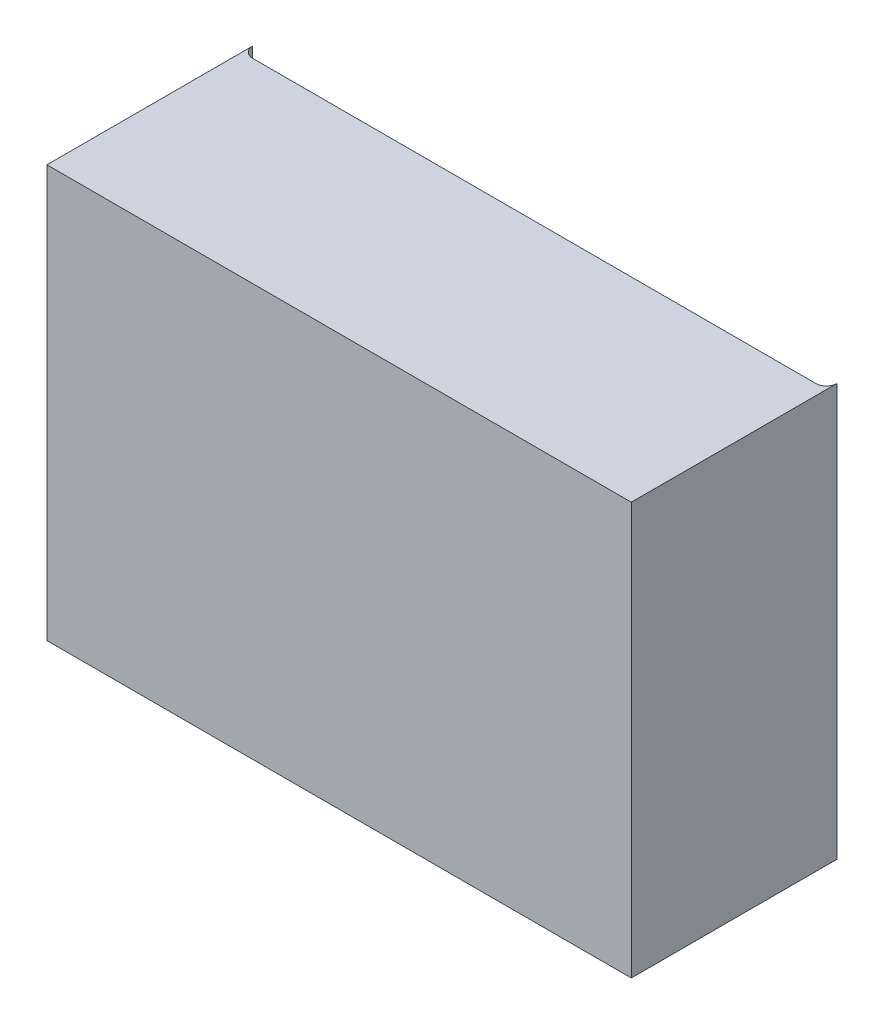
ISO-10303-21;
HEADER;
FILE_DESCRIPTION(('STEP AP214'),'2;1');
FILE_NAME('part.step','',(''),(''),'','','');
FILE_SCHEMA(('AUTOMOTIVE_DESIGN { 1 0 10303 214 1 1 1 1 }'));
ENDSEC;
DATA;
#1=APPLICATION_CONTEXT('core data for automotive mechanical design processes');
#2=APPLICATION_PROTOCOL_DEFINITION('international standard','automotive_design',2000,#1);
#3=PRODUCT_CONTEXT('',#1,'mechanical');
#4=PRODUCT('Part','Part','',(#3));
#5=PRODUCT_RELATED_PRODUCT_CATEGORY('part','',(#4));
#6=PRODUCT_DEFINITION_FORMATION('','',#4);
#7=PRODUCT_DEFINITION_CONTEXT('part definition',#1,'design');
#8=PRODUCT_DEFINITION('design','',#6,#7);
#9=PRODUCT_DEFINITION_SHAPE('','',#8);
#10=(LENGTH_UNIT() NAMED_UNIT(*) SI_UNIT(.MILLI.,.METRE.));
#11=(NAMED_UNIT(*) PLANE_ANGLE_UNIT() SI_UNIT($,.RADIAN.));
#12=(NAMED_UNIT(*) SI_UNIT($,.STERADIAN.) SOLID_ANGLE_UNIT());
#13=UNCERTAINTY_MEASURE_WITH_UNIT(LENGTH_MEASURE(1.E-05),#10,'distance_accuracy_value','');
#14=(GEOMETRIC_REPRESENTATION_CONTEXT(3) GLOBAL_UNCERTAINTY_ASSIGNED_CONTEXT((#13)) GLOBAL_UNIT_ASSIGNED_CONTEXT((#10,
#11,#12)) REPRESENTATION_CONTEXT('',''));
#15=CARTESIAN_POINT('',(0.,0.,0.));
#16=DIRECTION('',(0.,0.,1.));
#17=DIRECTION('',(1.,0.,0.));
#18=AXIS2_PLACEMENT_3D('',#15,#16,#17);
#19=CARTESIAN_POINT('',(1.052,0.77,0.12));
#20=DIRECTION('',(0.,-1.,0.));
#21=DIRECTION('',(0.,0.,-1.));
#22=AXIS2_PLACEMENT_3D('',#19,#20,#21);
#23=CYLINDRICAL_SURFACE('',#22,0.04);
#24=DIRECTION('',(0.,1.,0.));
#25=VECTOR('',#24,1.);
#26=CARTESIAN_POINT('',(1.052,0.77,0.16));
#27=LINE('',#26,#25);
#28=CARTESIAN_POINT('',(1.052,-0.77,0.16));
#29=VERTEX_POINT('',#28);
#30=CARTESIAN_POINT('',(1.052,0.77,0.16));
#31=VERTEX_POINT('',#30);
#32=EDGE_CURVE('E73',#29,#31,#27,.T.);
#33=ORIENTED_EDGE('',*,*,#32,.T.);
#34=CARTESIAN_POINT('',(1.052,0.77,0.12));
#35=DIRECTION('',(0.,-1.,0.));
#36=DIRECTION('',(0.,0.,-1.));
#37=AXIS2_PLACEMENT_3D('',#34,#35,#36);
#38=CIRCLE('',#37,0.04);
#39=CARTESIAN_POINT('',(1.092,0.77,0.12));
#40=VERTEX_POINT('',#39);
#41=EDGE_CURVE('E20',#40,#31,#38,.T.);
#42=ORIENTED_EDGE('',*,*,#41,.F.);
#43=DIRECTION('',(0.,1.,0.));
#44=VECTOR('',#43,1.);
#45=CARTESIAN_POINT('',(1.092,0.,0.12));
#46=LINE('',#45,#44);
#47=CARTESIAN_POINT('',(1.092,-0.77,0.12));
#48=VERTEX_POINT('',#47);
#49=EDGE_CURVE('E70',#48,#40,#46,.T.);
#50=ORIENTED_EDGE('',*,*,#49,.F.);
#51=CARTESIAN_POINT('',(1.052,-0.77,0.12));
#52=DIRECTION('',(0.,-1.,0.));
#53=DIRECTION('',(0.,0.,-1.));
#54=AXIS2_PLACEMENT_3D('',#51,#52,#53);
#55=CIRCLE('',#54,0.04);
#56=EDGE_CURVE('E78',#29,#48,#55,.F.);
#57=ORIENTED_EDGE('',*,*,#56,.F.);
#58=EDGE_LOOP('',(#33,#42,#50,#57));
#59=FACE_BOUND('',#58,.T.);
#60=ADVANCED_FACE('F17',(#59),#23,.F.);
#61=CARTESIAN_POINT('',(-1.052,0.77,0.12));
#62=DIRECTION('',(0.,-1.,0.));
#63=DIRECTION('',(0.,0.,-1.));
#64=AXIS2_PLACEMENT_3D('',#61,#62,#63);
#65=CYLINDRICAL_SURFACE('',#64,0.04);
#66=DIRECTION('',(0.,1.,0.));
#67=VECTOR('',#66,1.);
#68=CARTESIAN_POINT('',(-1.092,0.,0.12));
#69=LINE('',#68,#67);
#70=CARTESIAN_POINT('',(-1.092,0.77,0.12));
#71=VERTEX_POINT('',#70);
#72=CARTESIAN_POINT('',(-1.092,-0.77,0.12));
#73=VERTEX_POINT('',#72);
#74=EDGE_CURVE('E104',#71,#73,#69,.F.);
#75=ORIENTED_EDGE('',*,*,#74,.F.);
#76=CARTESIAN_POINT('',(-1.052,0.77,0.12));
#77=DIRECTION('',(0.,-1.,0.));
#78=DIRECTION('',(0.,0.,-1.));
#79=AXIS2_PLACEMENT_3D('',#76,#77,#78);
#80=CIRCLE('',#79,0.04);
#81=CARTESIAN_POINT('',(-1.052,0.77,0.16));
#82=VERTEX_POINT('',#81);
#83=EDGE_CURVE('E91',#71,#82,#80,.F.);
#84=ORIENTED_EDGE('',*,*,#83,.T.);
#85=DIRECTION('',(0.,1.,0.));
#86=VECTOR('',#85,1.);
#87=CARTESIAN_POINT('',(-1.052,0.77,0.16));
#88=LINE('',#87,#86);
#89=CARTESIAN_POINT('',(-1.052,-0.77,0.16));
#90=VERTEX_POINT('',#89);
#91=EDGE_CURVE('E85',#82,#90,#88,.F.);
#92=ORIENTED_EDGE('',*,*,#91,.T.);
#93=CARTESIAN_POINT('',(-1.052,-0.77,0.12));
#94=DIRECTION('',(0.,-1.,0.));
#95=DIRECTION('',(0.,0.,-1.));
#96=AXIS2_PLACEMENT_3D('',#93,#94,#95);
#97=CIRCLE('',#96,0.04);
#98=EDGE_CURVE('E103',#73,#90,#97,.F.);
#99=ORIENTED_EDGE('',*,*,#98,.F.);
#100=EDGE_LOOP('',(#75,#84,#92,#99));
#101=FACE_BOUND('',#100,.T.);
#102=ADVANCED_FACE('F134',(#101),#65,.F.);
#103=CARTESIAN_POINT('',(1.052,0.77,0.16));
#104=DIRECTION('',(0.,0.,1.));
#105=DIRECTION('',(1.,0.,0.));
#106=AXIS2_PLACEMENT_3D('',#103,#104,#105);
#107=PLANE('',#106);
#108=ORIENTED_EDGE('',*,*,#91,.F.);
#109=DIRECTION('',(1.,0.,0.));
#110=VECTOR('',#109,1.);
#111=CARTESIAN_POINT('',(0.,0.77,0.16));
#112=LINE('',#111,#110);
#113=EDGE_CURVE('E93',#82,#31,#112,.T.);
#114=ORIENTED_EDGE('',*,*,#113,.T.);
#115=ORIENTED_EDGE('',*,*,#32,.F.);
#116=DIRECTION('',(1.,0.,0.));
#117=VECTOR('',#116,1.);
#118=CARTESIAN_POINT('',(0.,-0.77,0.16));
#119=LINE('',#118,#117);
#120=EDGE_CURVE('E115',#90,#29,#119,.T.);
#121=ORIENTED_EDGE('',*,*,#120,.F.);
#122=EDGE_LOOP('',(#108,#114,#115,#121));
#123=FACE_BOUND('',#122,.T.);
#124=ADVANCED_FACE('F131',(#123),#107,.F.);
#125=CARTESIAN_POINT('',(1.092,0.,0.635));
#126=DIRECTION('',(1.,0.,0.));
#127=DIRECTION('',(0.,0.,-1.));
#128=AXIS2_PLACEMENT_3D('',#125,#126,#127);
#129=PLANE('',#128);
#130=DIRECTION('',(0.,1.,0.));
#131=VECTOR('',#130,1.);
#132=CARTESIAN_POINT('',(1.092,0.,0.889));
#133=LINE('',#132,#131);
#134=CARTESIAN_POINT('',(1.092,-0.77,0.889));
#135=VERTEX_POINT('',#134);
#136=CARTESIAN_POINT('',(1.092,0.77,0.889));
#137=VERTEX_POINT('',#136);
#138=EDGE_CURVE('E113',#135,#137,#133,.T.);
#139=ORIENTED_EDGE('',*,*,#138,.F.);
#140=DIRECTION('',(0.,0.,-1.));
#141=VECTOR('',#140,1.);
#142=CARTESIAN_POINT('',(1.092,-0.77,0.3775));
#143=LINE('',#142,#141);
#144=EDGE_CURVE('E84',#48,#135,#143,.F.);
#145=ORIENTED_EDGE('',*,*,#144,.F.);
#146=ORIENTED_EDGE('',*,*,#49,.T.);
#147=DIRECTION('',(0.,0.,-1.));
#148=VECTOR('',#147,1.);
#149=CARTESIAN_POINT('',(1.092,0.77,0.3775));
#150=LINE('',#149,#148);
#151=EDGE_CURVE('E81',#40,#137,#150,.F.);
#152=ORIENTED_EDGE('',*,*,#151,.T.);
#153=EDGE_LOOP('',(#139,#145,#146,#152));
#154=FACE_BOUND('',#153,.T.);
#155=ADVANCED_FACE('F80',(#154),#129,.T.);
#156=CARTESIAN_POINT('',(0.,0.77,0.3775));
#157=DIRECTION('',(0.,-1.,0.));
#158=DIRECTION('',(0.,0.,-1.));
#159=AXIS2_PLACEMENT_3D('',#156,#157,#158);
#160=PLANE('',#159);
#161=ORIENTED_EDGE('',*,*,#113,.F.);
#162=ORIENTED_EDGE('',*,*,#83,.F.);
#163=DIRECTION('',(0.,0.,1.));
#164=VECTOR('',#163,1.);
#165=CARTESIAN_POINT('',(-1.092,0.77,0.12));
#166=LINE('',#165,#164);
#167=CARTESIAN_POINT('',(-1.092,0.77,0.889));
#168=VERTEX_POINT('',#167);
#169=EDGE_CURVE('E105',#168,#71,#166,.F.);
#170=ORIENTED_EDGE('',*,*,#169,.F.);
#171=DIRECTION('',(1.,0.,0.));
#172=VECTOR('',#171,1.);
#173=CARTESIAN_POINT('',(-1.092,0.77,0.889));
#174=LINE('',#173,#172);
#175=EDGE_CURVE('E89',#137,#168,#174,.F.);
#176=ORIENTED_EDGE('',*,*,#175,.F.);
#177=ORIENTED_EDGE('',*,*,#151,.F.);
#178=ORIENTED_EDGE('',*,*,#41,.T.);
#179=EDGE_LOOP('',(#161,#162,#170,#176,#177,#178));
#180=FACE_BOUND('',#179,.T.);
#181=ADVANCED_FACE('F87',(#180),#160,.F.);
#182=CARTESIAN_POINT('',(-1.092,0.,0.12));
#183=DIRECTION('',(-1.,0.,0.));
#184=DIRECTION('',(0.,0.,1.));
#185=AXIS2_PLACEMENT_3D('',#182,#183,#184);
#186=PLANE('',#185);
#187=ORIENTED_EDGE('',*,*,#74,.T.);
#188=DIRECTION('',(0.,0.,-1.));
#189=VECTOR('',#188,1.);
#190=CARTESIAN_POINT('',(-1.092,-0.77,0.3775));
#191=LINE('',#190,#189);
#192=CARTESIAN_POINT('',(-1.092,-0.77,0.889));
#193=VERTEX_POINT('',#192);
#194=EDGE_CURVE('E35',#193,#73,#191,.T.);
#195=ORIENTED_EDGE('',*,*,#194,.F.);
#196=DIRECTION('',(0.,1.,0.));
#197=VECTOR('',#196,1.);
#198=CARTESIAN_POINT('',(-1.092,0.,0.889));
#199=LINE('',#198,#197);
#200=EDGE_CURVE('E26',#168,#193,#199,.F.);
#201=ORIENTED_EDGE('',*,*,#200,.F.);
#202=ORIENTED_EDGE('',*,*,#169,.T.);
#203=EDGE_LOOP('',(#187,#195,#201,#202));
#204=FACE_BOUND('',#203,.T.);
#205=ADVANCED_FACE('F135',(#204),#186,.T.);
#206=CARTESIAN_POINT('',(0.,-0.77,0.3775));
#207=DIRECTION('',(0.,-1.,0.));
#208=DIRECTION('',(0.,0.,-1.));
#209=AXIS2_PLACEMENT_3D('',#206,#207,#208);
#210=PLANE('',#209);
#211=ORIENTED_EDGE('',*,*,#98,.T.);
#212=ORIENTED_EDGE('',*,*,#120,.T.);
#213=ORIENTED_EDGE('',*,*,#56,.T.);
#214=ORIENTED_EDGE('',*,*,#144,.T.);
#215=DIRECTION('',(1.,0.,0.));
#216=VECTOR('',#215,1.);
#217=CARTESIAN_POINT('',(-1.092,-0.77,0.889));
#218=LINE('',#217,#216);
#219=EDGE_CURVE('E11',#193,#135,#218,.T.);
#220=ORIENTED_EDGE('',*,*,#219,.F.);
#221=ORIENTED_EDGE('',*,*,#194,.T.);
#222=EDGE_LOOP('',(#211,#212,#213,#214,#220,#221));
#223=FACE_BOUND('',#222,.T.);
#224=ADVANCED_FACE('F127',(#223),#210,.T.);
#225=CARTESIAN_POINT('',(-1.092,0.,0.889));
#226=DIRECTION('',(0.,0.,1.));
#227=DIRECTION('',(1.,0.,0.));
#228=AXIS2_PLACEMENT_3D('',#225,#226,#227);
#229=PLANE('',#228);
#230=ORIENTED_EDGE('',*,*,#200,.T.);
#231=ORIENTED_EDGE('',*,*,#219,.T.);
#232=ORIENTED_EDGE('',*,*,#138,.T.);
#233=ORIENTED_EDGE('',*,*,#175,.T.);
#234=EDGE_LOOP('',(#230,#231,#232,#233));
#235=FACE_BOUND('',#234,.T.);
#236=ADVANCED_FACE('F137',(#235),#229,.T.);
#237=CLOSED_SHELL('',(#60,#102,#124,#155,#181,#205,#224,#236));
#238=MANIFOLD_SOLID_BREP('B1',#237);
#239=ADVANCED_BREP_SHAPE_REPRESENTATION('',(#18,#238),#14);
#240=SHAPE_DEFINITION_REPRESENTATION(#9,#239);
ENDSEC;
END-ISO-10303-21;
